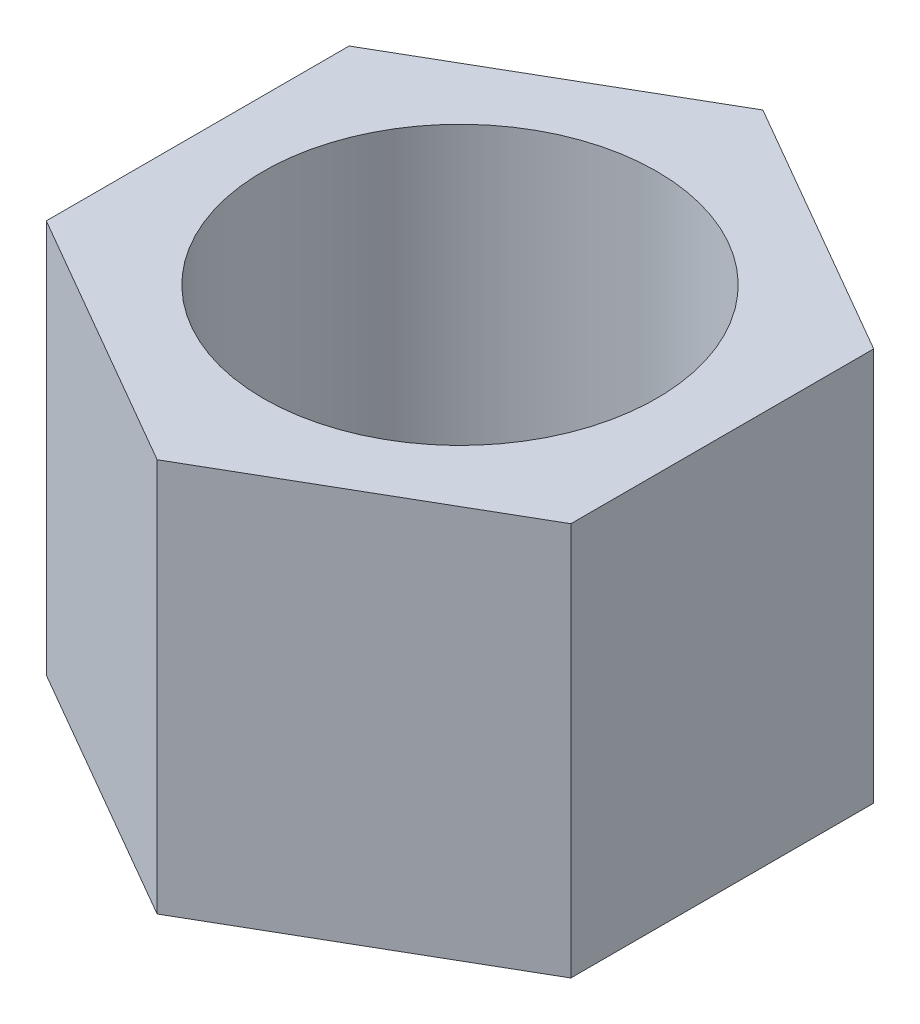
ISO-10303-21;
HEADER;
FILE_DESCRIPTION(('STEP AP214'),'2;1');
FILE_NAME('part.step','',(''),(''),'','','');
FILE_SCHEMA(('AUTOMOTIVE_DESIGN { 1 0 10303 214 1 1 1 1 }'));
ENDSEC;
DATA;
#1=APPLICATION_CONTEXT('core data for automotive mechanical design processes');
#2=APPLICATION_PROTOCOL_DEFINITION('international standard','automotive_design',2000,#1);
#3=PRODUCT_CONTEXT('',#1,'mechanical');
#4=PRODUCT('Part','Part','',(#3));
#5=PRODUCT_RELATED_PRODUCT_CATEGORY('part','',(#4));
#6=PRODUCT_DEFINITION_FORMATION('','',#4);
#7=PRODUCT_DEFINITION_CONTEXT('part definition',#1,'design');
#8=PRODUCT_DEFINITION('design','',#6,#7);
#9=PRODUCT_DEFINITION_SHAPE('','',#8);
#10=(LENGTH_UNIT() NAMED_UNIT(*) SI_UNIT(.MILLI.,.METRE.));
#11=(NAMED_UNIT(*) PLANE_ANGLE_UNIT() SI_UNIT($,.RADIAN.));
#12=(NAMED_UNIT(*) SI_UNIT($,.STERADIAN.) SOLID_ANGLE_UNIT());
#13=UNCERTAINTY_MEASURE_WITH_UNIT(LENGTH_MEASURE(1.E-05),#10,'distance_accuracy_value','');
#14=(GEOMETRIC_REPRESENTATION_CONTEXT(3) GLOBAL_UNCERTAINTY_ASSIGNED_CONTEXT((#13)) GLOBAL_UNIT_ASSIGNED_CONTEXT((#10,
#11,#12)) REPRESENTATION_CONTEXT('',''));
#15=CARTESIAN_POINT('',(0.,0.,0.));
#16=DIRECTION('',(0.,0.,1.));
#17=DIRECTION('',(1.,0.,0.));
#18=AXIS2_PLACEMENT_3D('',#15,#16,#17);
#19=CARTESIAN_POINT('',(0.,3.,0.));
#20=DIRECTION('',(0.,1.,0.));
#21=DIRECTION('',(0.,0.,1.));
#22=AXIS2_PLACEMENT_3D('',#19,#20,#21);
#23=PLANE('',#22);
#24=DIRECTION('',(-0.866025403784439,0.,-0.5));
#25=VECTOR('',#24,1.);
#26=CARTESIAN_POINT('',(2.,3.,-1.15470053837925));
#27=LINE('',#26,#25);
#28=CARTESIAN_POINT('',(2.,3.,-1.15470053837925));
#29=VERTEX_POINT('',#28);
#30=CARTESIAN_POINT('',(0.,3.,-2.3094010767585));
#31=VERTEX_POINT('',#30);
#32=EDGE_CURVE('E131',#29,#31,#27,.T.);
#33=ORIENTED_EDGE('',*,*,#32,.T.);
#34=DIRECTION('',(-0.866025403784439,0.,0.5));
#35=VECTOR('',#34,1.);
#36=CARTESIAN_POINT('',(0.,3.,-2.3094010767585));
#37=LINE('',#36,#35);
#38=CARTESIAN_POINT('',(-2.,3.,-1.15470053837925));
#39=VERTEX_POINT('',#38);
#40=EDGE_CURVE('E89',#31,#39,#37,.T.);
#41=ORIENTED_EDGE('',*,*,#40,.T.);
#42=DIRECTION('',(0.,0.,1.));
#43=VECTOR('',#42,1.);
#44=CARTESIAN_POINT('',(-2.,3.,-1.15470053837925));
#45=LINE('',#44,#43);
#46=CARTESIAN_POINT('',(-2.,3.,1.15470053837925));
#47=VERTEX_POINT('',#46);
#48=EDGE_CURVE('E102',#39,#47,#45,.T.);
#49=ORIENTED_EDGE('',*,*,#48,.T.);
#50=DIRECTION('',(0.866025403784439,0.,0.5));
#51=VECTOR('',#50,1.);
#52=CARTESIAN_POINT('',(-2.,3.,1.15470053837925));
#53=LINE('',#52,#51);
#54=CARTESIAN_POINT('',(0.,3.,2.3094010767585));
#55=VERTEX_POINT('',#54);
#56=EDGE_CURVE('E96',#47,#55,#53,.T.);
#57=ORIENTED_EDGE('',*,*,#56,.T.);
#58=DIRECTION('',(0.866025403784439,0.,-0.5));
#59=VECTOR('',#58,1.);
#60=CARTESIAN_POINT('',(0.,3.,2.3094010767585));
#61=LINE('',#60,#59);
#62=CARTESIAN_POINT('',(2.,3.,1.15470053837925));
#63=VERTEX_POINT('',#62);
#64=EDGE_CURVE('E100',#55,#63,#61,.T.);
#65=ORIENTED_EDGE('',*,*,#64,.T.);
#66=DIRECTION('',(0.,0.,-1.));
#67=VECTOR('',#66,1.);
#68=CARTESIAN_POINT('',(2.,3.,1.15470053837925));
#69=LINE('',#68,#67);
#70=EDGE_CURVE('E52',#63,#29,#69,.T.);
#71=ORIENTED_EDGE('',*,*,#70,.T.);
#72=EDGE_LOOP('',(#33,#41,#49,#57,#65,#71));
#73=FACE_BOUND('',#72,.T.);
#74=CARTESIAN_POINT('',(0.,3.,0.));
#75=DIRECTION('',(0.,1.,0.));
#76=DIRECTION('',(0.,0.,1.));
#77=AXIS2_PLACEMENT_3D('',#74,#75,#76);
#78=CIRCLE('',#77,1.5);
#79=CARTESIAN_POINT('',(0.,3.,1.5));
#80=VERTEX_POINT('',#79);
#81=EDGE_CURVE('E124',#80,#80,#78,.T.);
#82=ORIENTED_EDGE('',*,*,#81,.F.);
#83=EDGE_LOOP('',(#82));
#84=FACE_BOUND('',#83,.T.);
#85=ADVANCED_FACE('F35',(#73,#84),#23,.T.);
#86=CARTESIAN_POINT('',(0.,0.,0.));
#87=DIRECTION('',(0.,1.,0.));
#88=DIRECTION('',(0.,0.,1.));
#89=AXIS2_PLACEMENT_3D('',#86,#87,#88);
#90=PLANE('',#89);
#91=DIRECTION('',(-0.866025403784439,0.,-0.5));
#92=VECTOR('',#91,1.);
#93=CARTESIAN_POINT('',(2.,0.,-1.15470053837925));
#94=LINE('',#93,#92);
#95=CARTESIAN_POINT('',(2.,0.,-1.15470053837925));
#96=VERTEX_POINT('',#95);
#97=CARTESIAN_POINT('',(0.,0.,-2.3094010767585));
#98=VERTEX_POINT('',#97);
#99=EDGE_CURVE('E120',#96,#98,#94,.T.);
#100=ORIENTED_EDGE('',*,*,#99,.F.);
#101=DIRECTION('',(0.,0.,-1.));
#102=VECTOR('',#101,1.);
#103=CARTESIAN_POINT('',(2.,0.,1.15470053837925));
#104=LINE('',#103,#102);
#105=CARTESIAN_POINT('',(2.,0.,1.15470053837925));
#106=VERTEX_POINT('',#105);
#107=EDGE_CURVE('E81',#106,#96,#104,.T.);
#108=ORIENTED_EDGE('',*,*,#107,.F.);
#109=DIRECTION('',(0.866025403784439,0.,-0.5));
#110=VECTOR('',#109,1.);
#111=CARTESIAN_POINT('',(0.,0.,2.3094010767585));
#112=LINE('',#111,#110);
#113=CARTESIAN_POINT('',(0.,0.,2.3094010767585));
#114=VERTEX_POINT('',#113);
#115=EDGE_CURVE('E75',#114,#106,#112,.T.);
#116=ORIENTED_EDGE('',*,*,#115,.F.);
#117=DIRECTION('',(0.866025403784439,0.,0.5));
#118=VECTOR('',#117,1.);
#119=CARTESIAN_POINT('',(-2.,0.,1.15470053837925));
#120=LINE('',#119,#118);
#121=CARTESIAN_POINT('',(-2.,0.,1.15470053837925));
#122=VERTEX_POINT('',#121);
#123=EDGE_CURVE('E110',#122,#114,#120,.T.);
#124=ORIENTED_EDGE('',*,*,#123,.F.);
#125=DIRECTION('',(0.,0.,1.));
#126=VECTOR('',#125,1.);
#127=CARTESIAN_POINT('',(-2.,0.,-1.15470053837925));
#128=LINE('',#127,#126);
#129=CARTESIAN_POINT('',(-2.,0.,-1.15470053837925));
#130=VERTEX_POINT('',#129);
#131=EDGE_CURVE('E126',#130,#122,#128,.T.);
#132=ORIENTED_EDGE('',*,*,#131,.F.);
#133=DIRECTION('',(-0.866025403784439,0.,0.5));
#134=VECTOR('',#133,1.);
#135=CARTESIAN_POINT('',(0.,0.,-2.3094010767585));
#136=LINE('',#135,#134);
#137=EDGE_CURVE('E123',#98,#130,#136,.T.);
#138=ORIENTED_EDGE('',*,*,#137,.F.);
#139=EDGE_LOOP('',(#100,#108,#116,#124,#132,#138));
#140=FACE_BOUND('',#139,.T.);
#141=CARTESIAN_POINT('',(0.,0.,0.));
#142=DIRECTION('',(0.,1.,0.));
#143=DIRECTION('',(0.,0.,1.));
#144=AXIS2_PLACEMENT_3D('',#141,#142,#143);
#145=CIRCLE('',#144,1.5);
#146=CARTESIAN_POINT('',(0.,0.,1.5));
#147=VERTEX_POINT('',#146);
#148=EDGE_CURVE('E224',#147,#147,#145,.T.);
#149=ORIENTED_EDGE('',*,*,#148,.T.);
#150=EDGE_LOOP('',(#149));
#151=FACE_BOUND('',#150,.T.);
#152=ADVANCED_FACE('F140',(#140,#151),#90,.F.);
#153=CARTESIAN_POINT('',(2.,3.,-1.15470053837925));
#154=DIRECTION('',(-0.5,0.,0.866025403784439));
#155=DIRECTION('',(0.866025403784439,0.,0.5));
#156=AXIS2_PLACEMENT_3D('',#153,#154,#155);
#157=PLANE('',#156);
#158=ORIENTED_EDGE('',*,*,#99,.T.);
#159=DIRECTION('',(0.,-1.,0.));
#160=VECTOR('',#159,1.);
#161=CARTESIAN_POINT('',(0.,3.,-2.3094010767585));
#162=LINE('',#161,#160);
#163=EDGE_CURVE('E11',#31,#98,#162,.T.);
#164=ORIENTED_EDGE('',*,*,#163,.F.);
#165=ORIENTED_EDGE('',*,*,#32,.F.);
#166=DIRECTION('',(0.,-1.,0.));
#167=VECTOR('',#166,1.);
#168=CARTESIAN_POINT('',(2.,3.,-1.15470053837925));
#169=LINE('',#168,#167);
#170=EDGE_CURVE('E116',#29,#96,#169,.T.);
#171=ORIENTED_EDGE('',*,*,#170,.T.);
#172=EDGE_LOOP('',(#158,#164,#165,#171));
#173=FACE_BOUND('',#172,.T.);
#174=ADVANCED_FACE('F37',(#173),#157,.F.);
#175=CARTESIAN_POINT('',(0.,3.,-2.3094010767585));
#176=DIRECTION('',(0.5,0.,0.866025403784438));
#177=DIRECTION('',(0.866025403784439,0.,-0.5));
#178=AXIS2_PLACEMENT_3D('',#175,#176,#177);
#179=PLANE('',#178);
#180=ORIENTED_EDGE('',*,*,#137,.T.);
#181=DIRECTION('',(0.,-1.,0.));
#182=VECTOR('',#181,1.);
#183=CARTESIAN_POINT('',(-2.,3.,-1.15470053837925));
#184=LINE('',#183,#182);
#185=EDGE_CURVE('E44',#39,#130,#184,.T.);
#186=ORIENTED_EDGE('',*,*,#185,.F.);
#187=ORIENTED_EDGE('',*,*,#40,.F.);
#188=ORIENTED_EDGE('',*,*,#163,.T.);
#189=EDGE_LOOP('',(#180,#186,#187,#188));
#190=FACE_BOUND('',#189,.T.);
#191=ADVANCED_FACE('F165',(#190),#179,.F.);
#192=CARTESIAN_POINT('',(-2.,3.,-1.15470053837925));
#193=DIRECTION('',(1.,0.,0.));
#194=DIRECTION('',(0.,0.,-1.));
#195=AXIS2_PLACEMENT_3D('',#192,#193,#194);
#196=PLANE('',#195);
#197=ORIENTED_EDGE('',*,*,#131,.T.);
#198=DIRECTION('',(0.,-1.,0.));
#199=VECTOR('',#198,1.);
#200=CARTESIAN_POINT('',(-2.,3.,1.15470053837925));
#201=LINE('',#200,#199);
#202=EDGE_CURVE('E111',#47,#122,#201,.T.);
#203=ORIENTED_EDGE('',*,*,#202,.F.);
#204=ORIENTED_EDGE('',*,*,#48,.F.);
#205=ORIENTED_EDGE('',*,*,#185,.T.);
#206=EDGE_LOOP('',(#197,#203,#204,#205));
#207=FACE_BOUND('',#206,.T.);
#208=ADVANCED_FACE('F137',(#207),#196,.F.);
#209=CARTESIAN_POINT('',(-2.,3.,1.15470053837925));
#210=DIRECTION('',(0.5,0.,-0.866025403784439));
#211=DIRECTION('',(-0.866025403784439,0.,-0.5));
#212=AXIS2_PLACEMENT_3D('',#209,#210,#211);
#213=PLANE('',#212);
#214=ORIENTED_EDGE('',*,*,#123,.T.);
#215=DIRECTION('',(0.,-1.,0.));
#216=VECTOR('',#215,1.);
#217=CARTESIAN_POINT('',(0.,3.,2.3094010767585));
#218=LINE('',#217,#216);
#219=EDGE_CURVE('E107',#55,#114,#218,.T.);
#220=ORIENTED_EDGE('',*,*,#219,.F.);
#221=ORIENTED_EDGE('',*,*,#56,.F.);
#222=ORIENTED_EDGE('',*,*,#202,.T.);
#223=EDGE_LOOP('',(#214,#220,#221,#222));
#224=FACE_BOUND('',#223,.T.);
#225=ADVANCED_FACE('F108',(#224),#213,.F.);
#226=CARTESIAN_POINT('',(0.,3.,2.3094010767585));
#227=DIRECTION('',(-0.5,0.,-0.866025403784439));
#228=DIRECTION('',(-0.866025403784439,0.,0.5));
#229=AXIS2_PLACEMENT_3D('',#226,#227,#228);
#230=PLANE('',#229);
#231=ORIENTED_EDGE('',*,*,#115,.T.);
#232=DIRECTION('',(0.,-1.,0.));
#233=VECTOR('',#232,1.);
#234=CARTESIAN_POINT('',(2.,3.,1.15470053837925));
#235=LINE('',#234,#233);
#236=EDGE_CURVE('E112',#63,#106,#235,.T.);
#237=ORIENTED_EDGE('',*,*,#236,.F.);
#238=ORIENTED_EDGE('',*,*,#64,.F.);
#239=ORIENTED_EDGE('',*,*,#219,.T.);
#240=EDGE_LOOP('',(#231,#237,#238,#239));
#241=FACE_BOUND('',#240,.T.);
#242=ADVANCED_FACE('F114',(#241),#230,.F.);
#243=CARTESIAN_POINT('',(2.,3.,1.15470053837925));
#244=DIRECTION('',(-1.,0.,0.));
#245=DIRECTION('',(0.,0.,1.));
#246=AXIS2_PLACEMENT_3D('',#243,#244,#245);
#247=PLANE('',#246);
#248=ORIENTED_EDGE('',*,*,#107,.T.);
#249=ORIENTED_EDGE('',*,*,#170,.F.);
#250=ORIENTED_EDGE('',*,*,#70,.F.);
#251=ORIENTED_EDGE('',*,*,#236,.T.);
#252=EDGE_LOOP('',(#248,#249,#250,#251));
#253=FACE_BOUND('',#252,.T.);
#254=ADVANCED_FACE('F145',(#253),#247,.F.);
#255=CARTESIAN_POINT('',(0.,3.,0.));
#256=DIRECTION('',(0.,-1.,0.));
#257=DIRECTION('',(0.,0.,-1.));
#258=AXIS2_PLACEMENT_3D('',#255,#256,#257);
#259=CYLINDRICAL_SURFACE('',#258,1.5);
#260=ORIENTED_EDGE('',*,*,#81,.T.);
#261=EDGE_LOOP('',(#260));
#262=FACE_BOUND('',#261,.T.);
#263=ORIENTED_EDGE('',*,*,#148,.F.);
#264=EDGE_LOOP('',(#263));
#265=FACE_BOUND('',#264,.T.);
#266=ADVANCED_FACE('F147',(#262,#265),#259,.F.);
#267=CLOSED_SHELL('',(#85,#152,#174,#191,#208,#225,#242,#254,#266));
#268=MANIFOLD_SOLID_BREP('B2',#267);
#269=ADVANCED_BREP_SHAPE_REPRESENTATION('',(#18,#268),#14);
#270=SHAPE_DEFINITION_REPRESENTATION(#9,#269);
ENDSEC;
END-ISO-10303-21;
